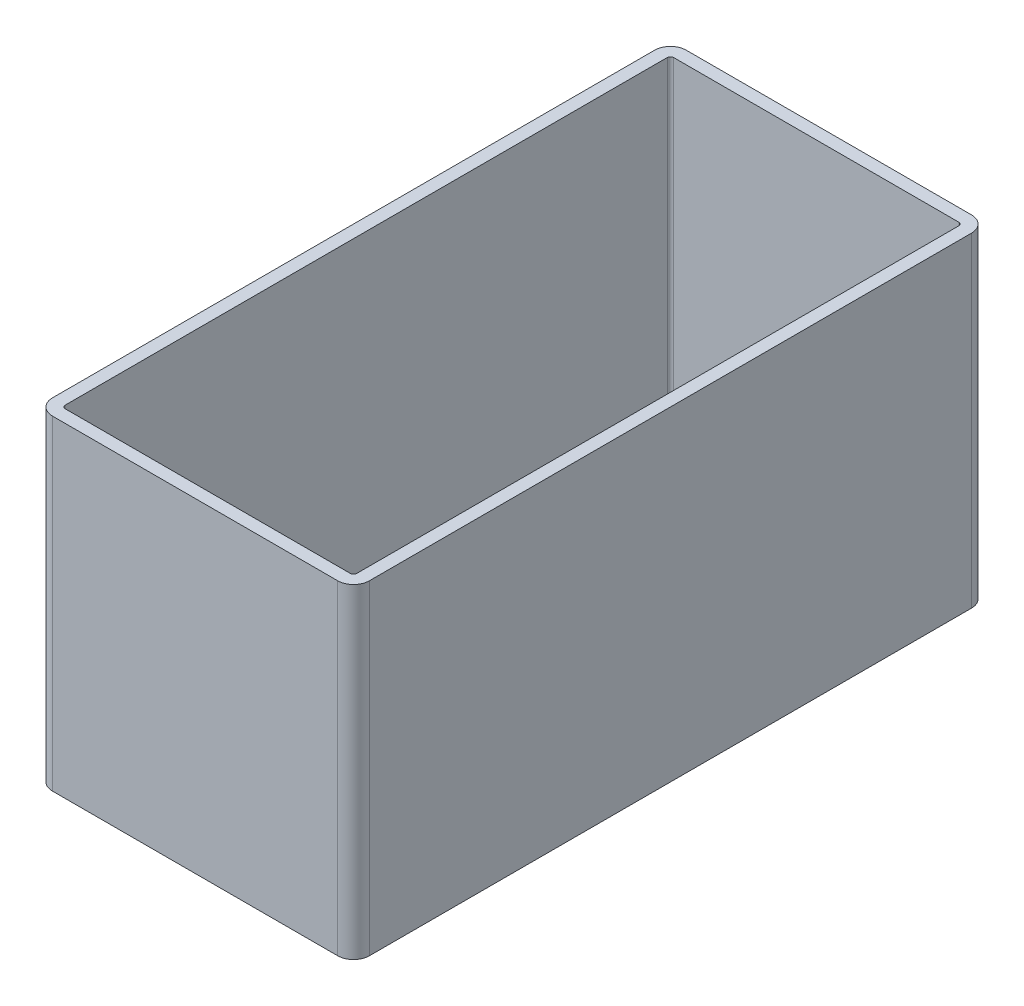
ISO-10303-21;
HEADER;
FILE_DESCRIPTION(('STEP AP214'),'2;1');
FILE_NAME('part.step','',(''),(''),'','','');
FILE_SCHEMA(('AUTOMOTIVE_DESIGN { 1 0 10303 214 1 1 1 1 }'));
ENDSEC;
DATA;
#1=APPLICATION_CONTEXT('core data for automotive mechanical design processes');
#2=APPLICATION_PROTOCOL_DEFINITION('international standard','automotive_design',2000,#1);
#3=PRODUCT_CONTEXT('',#1,'mechanical');
#4=PRODUCT('Part','Part','',(#3));
#5=PRODUCT_RELATED_PRODUCT_CATEGORY('part','',(#4));
#6=PRODUCT_DEFINITION_FORMATION('','',#4);
#7=PRODUCT_DEFINITION_CONTEXT('part definition',#1,'design');
#8=PRODUCT_DEFINITION('design','',#6,#7);
#9=PRODUCT_DEFINITION_SHAPE('','',#8);
#10=(LENGTH_UNIT() NAMED_UNIT(*) SI_UNIT(.MILLI.,.METRE.));
#11=(NAMED_UNIT(*) PLANE_ANGLE_UNIT() SI_UNIT($,.RADIAN.));
#12=(NAMED_UNIT(*) SI_UNIT($,.STERADIAN.) SOLID_ANGLE_UNIT());
#13=UNCERTAINTY_MEASURE_WITH_UNIT(LENGTH_MEASURE(1.E-05),#10,'distance_accuracy_value','');
#14=(GEOMETRIC_REPRESENTATION_CONTEXT(3) GLOBAL_UNCERTAINTY_ASSIGNED_CONTEXT((#13)) GLOBAL_UNIT_ASSIGNED_CONTEXT((#10,
#11,#12)) REPRESENTATION_CONTEXT('',''));
#15=CARTESIAN_POINT('',(0.,0.,0.));
#16=DIRECTION('',(0.,0.,1.));
#17=DIRECTION('',(1.,0.,0.));
#18=AXIS2_PLACEMENT_3D('',#15,#16,#17);
#19=CARTESIAN_POINT('',(9.99999999999999,10.25,-20.));
#20=DIRECTION('',(-1.,0.,0.));
#21=DIRECTION('',(0.,0.,1.));
#22=AXIS2_PLACEMENT_3D('',#19,#20,#21);
#23=PLANE('',#22);
#24=DIRECTION('',(0.,0.,-1.));
#25=VECTOR('',#24,1.);
#26=CARTESIAN_POINT('',(9.99999999999999,-10.25,-20.));
#27=LINE('',#26,#25);
#28=CARTESIAN_POINT('',(10.,-10.25,19.));
#29=VERTEX_POINT('',#28);
#30=CARTESIAN_POINT('',(9.99999999999999,-10.25,-19.));
#31=VERTEX_POINT('',#30);
#32=EDGE_CURVE('E203',#29,#31,#27,.T.);
#33=ORIENTED_EDGE('',*,*,#32,.T.);
#34=DIRECTION('',(0.,-1.,0.));
#35=VECTOR('',#34,1.);
#36=CARTESIAN_POINT('',(9.99999999999999,10.25,-19.));
#37=LINE('',#36,#35);
#38=CARTESIAN_POINT('',(9.99999999999999,10.25,-19.));
#39=VERTEX_POINT('',#38);
#40=EDGE_CURVE('E267',#31,#39,#37,.F.);
#41=ORIENTED_EDGE('',*,*,#40,.T.);
#42=DIRECTION('',(0.,0.,-1.));
#43=VECTOR('',#42,1.);
#44=CARTESIAN_POINT('',(9.99999999999999,10.25,-20.));
#45=LINE('',#44,#43);
#46=CARTESIAN_POINT('',(10.,10.25,19.));
#47=VERTEX_POINT('',#46);
#48=EDGE_CURVE('E215',#47,#39,#45,.T.);
#49=ORIENTED_EDGE('',*,*,#48,.F.);
#50=DIRECTION('',(0.,-1.,0.));
#51=VECTOR('',#50,1.);
#52=CARTESIAN_POINT('',(10.,10.25,19.));
#53=LINE('',#52,#51);
#54=EDGE_CURVE('E264',#47,#29,#53,.T.);
#55=ORIENTED_EDGE('',*,*,#54,.T.);
#56=EDGE_LOOP('',(#33,#41,#49,#55));
#57=FACE_BOUND('',#56,.T.);
#58=ADVANCED_FACE('F34',(#57),#23,.F.);
#59=CARTESIAN_POINT('',(-10.,10.25,-20.));
#60=DIRECTION('',(0.,0.,1.));
#61=DIRECTION('',(1.,0.,0.));
#62=AXIS2_PLACEMENT_3D('',#59,#60,#61);
#63=PLANE('',#62);
#64=DIRECTION('',(-1.,0.,0.));
#65=VECTOR('',#64,1.);
#66=CARTESIAN_POINT('',(-10.,-10.25,-20.));
#67=LINE('',#66,#65);
#68=CARTESIAN_POINT('',(8.99999999999999,-10.25,-20.));
#69=VERTEX_POINT('',#68);
#70=CARTESIAN_POINT('',(-9.00000000000001,-10.25,-20.));
#71=VERTEX_POINT('',#70);
#72=EDGE_CURVE('E231',#69,#71,#67,.T.);
#73=ORIENTED_EDGE('',*,*,#72,.T.);
#74=DIRECTION('',(0.,-1.,0.));
#75=VECTOR('',#74,1.);
#76=CARTESIAN_POINT('',(-9.00000000000001,10.25,-20.));
#77=LINE('',#76,#75);
#78=CARTESIAN_POINT('',(-9.00000000000001,10.25,-20.));
#79=VERTEX_POINT('',#78);
#80=EDGE_CURVE('E254',#71,#79,#77,.F.);
#81=ORIENTED_EDGE('',*,*,#80,.T.);
#82=DIRECTION('',(-1.,0.,0.));
#83=VECTOR('',#82,1.);
#84=CARTESIAN_POINT('',(-10.,10.25,-20.));
#85=LINE('',#84,#83);
#86=CARTESIAN_POINT('',(8.99999999999999,10.25,-20.));
#87=VERTEX_POINT('',#86);
#88=EDGE_CURVE('E218',#87,#79,#85,.T.);
#89=ORIENTED_EDGE('',*,*,#88,.F.);
#90=DIRECTION('',(0.,-1.,0.));
#91=VECTOR('',#90,1.);
#92=CARTESIAN_POINT('',(8.99999999999999,10.25,-20.));
#93=LINE('',#92,#91);
#94=EDGE_CURVE('E251',#87,#69,#93,.T.);
#95=ORIENTED_EDGE('',*,*,#94,.T.);
#96=EDGE_LOOP('',(#73,#81,#89,#95));
#97=FACE_BOUND('',#96,.T.);
#98=ADVANCED_FACE('F295',(#97),#63,.F.);
#99=CARTESIAN_POINT('',(-10.,10.25,-20.));
#100=DIRECTION('',(1.,0.,0.));
#101=DIRECTION('',(0.,0.,-1.));
#102=AXIS2_PLACEMENT_3D('',#99,#100,#101);
#103=PLANE('',#102);
#104=DIRECTION('',(0.,0.,1.));
#105=VECTOR('',#104,1.);
#106=CARTESIAN_POINT('',(-10.,10.25,-20.));
#107=LINE('',#106,#105);
#108=CARTESIAN_POINT('',(-10.,10.25,-19.));
#109=VERTEX_POINT('',#108);
#110=CARTESIAN_POINT('',(-10.,10.25,19.));
#111=VERTEX_POINT('',#110);
#112=EDGE_CURVE('E222',#109,#111,#107,.T.);
#113=ORIENTED_EDGE('',*,*,#112,.F.);
#114=DIRECTION('',(0.,-1.,0.));
#115=VECTOR('',#114,1.);
#116=CARTESIAN_POINT('',(-10.,10.25,-19.));
#117=LINE('',#116,#115);
#118=CARTESIAN_POINT('',(-10.,-10.25,-19.));
#119=VERTEX_POINT('',#118);
#120=EDGE_CURVE('E240',#109,#119,#117,.T.);
#121=ORIENTED_EDGE('',*,*,#120,.T.);
#122=DIRECTION('',(0.,0.,1.));
#123=VECTOR('',#122,1.);
#124=CARTESIAN_POINT('',(-10.,-10.25,-20.));
#125=LINE('',#124,#123);
#126=CARTESIAN_POINT('',(-10.,-10.25,19.));
#127=VERTEX_POINT('',#126);
#128=EDGE_CURVE('E234',#119,#127,#125,.T.);
#129=ORIENTED_EDGE('',*,*,#128,.T.);
#130=DIRECTION('',(0.,-1.,0.));
#131=VECTOR('',#130,1.);
#132=CARTESIAN_POINT('',(-10.,10.25,19.));
#133=LINE('',#132,#131);
#134=EDGE_CURVE('E228',#127,#111,#133,.F.);
#135=ORIENTED_EDGE('',*,*,#134,.T.);
#136=EDGE_LOOP('',(#113,#121,#129,#135));
#137=FACE_BOUND('',#136,.T.);
#138=ADVANCED_FACE('F303',(#137),#103,.F.);
#139=CARTESIAN_POINT('',(-10.,10.25,20.));
#140=DIRECTION('',(0.,0.,-1.));
#141=DIRECTION('',(-1.,0.,0.));
#142=AXIS2_PLACEMENT_3D('',#139,#140,#141);
#143=PLANE('',#142);
#144=DIRECTION('',(1.,0.,0.));
#145=VECTOR('',#144,1.);
#146=CARTESIAN_POINT('',(-10.,-10.25,20.));
#147=LINE('',#146,#145);
#148=CARTESIAN_POINT('',(-9.,-10.25,20.));
#149=VERTEX_POINT('',#148);
#150=CARTESIAN_POINT('',(9.,-10.25,20.));
#151=VERTEX_POINT('',#150);
#152=EDGE_CURVE('E219',#149,#151,#147,.T.);
#153=ORIENTED_EDGE('',*,*,#152,.T.);
#154=DIRECTION('',(0.,-1.,0.));
#155=VECTOR('',#154,1.);
#156=CARTESIAN_POINT('',(9.,10.25,20.));
#157=LINE('',#156,#155);
#158=CARTESIAN_POINT('',(9.,10.25,20.));
#159=VERTEX_POINT('',#158);
#160=EDGE_CURVE('E11',#151,#159,#157,.F.);
#161=ORIENTED_EDGE('',*,*,#160,.T.);
#162=DIRECTION('',(1.,0.,0.));
#163=VECTOR('',#162,1.);
#164=CARTESIAN_POINT('',(-10.,10.25,20.));
#165=LINE('',#164,#163);
#166=CARTESIAN_POINT('',(-9.,10.25,20.));
#167=VERTEX_POINT('',#166);
#168=EDGE_CURVE('E225',#167,#159,#165,.T.);
#169=ORIENTED_EDGE('',*,*,#168,.F.);
#170=DIRECTION('',(0.,-1.,0.));
#171=VECTOR('',#170,1.);
#172=CARTESIAN_POINT('',(-9.,10.25,20.));
#173=LINE('',#172,#171);
#174=EDGE_CURVE('E42',#167,#149,#173,.T.);
#175=ORIENTED_EDGE('',*,*,#174,.T.);
#176=EDGE_LOOP('',(#153,#161,#169,#175));
#177=FACE_BOUND('',#176,.T.);
#178=ADVANCED_FACE('F273',(#177),#143,.F.);
#179=CARTESIAN_POINT('',(0.,10.25,0.));
#180=DIRECTION('',(0.,1.,0.));
#181=DIRECTION('',(0.,0.,1.));
#182=AXIS2_PLACEMENT_3D('',#179,#180,#181);
#183=PLANE('',#182);
#184=CARTESIAN_POINT('',(8.99999999999999,10.25,-19.));
#185=DIRECTION('',(0.,1.,0.));
#186=DIRECTION('',(0.,0.,1.));
#187=AXIS2_PLACEMENT_3D('',#184,#185,#186);
#188=CIRCLE('',#187,0.200000000000004);
#189=CARTESIAN_POINT('',(9.2,10.25,-19.));
#190=VERTEX_POINT('',#189);
#191=CARTESIAN_POINT('',(8.99999999999999,10.25,-19.2));
#192=VERTEX_POINT('',#191);
#193=EDGE_CURVE('E49',#190,#192,#188,.T.);
#194=ORIENTED_EDGE('',*,*,#193,.F.);
#195=DIRECTION('',(0.,0.,-1.));
#196=VECTOR('',#195,1.);
#197=CARTESIAN_POINT('',(9.2,10.25,19.));
#198=LINE('',#197,#196);
#199=CARTESIAN_POINT('',(9.2,10.25,19.));
#200=VERTEX_POINT('',#199);
#201=EDGE_CURVE('E165',#200,#190,#198,.T.);
#202=ORIENTED_EDGE('',*,*,#201,.F.);
#203=CARTESIAN_POINT('',(9.,10.25,19.));
#204=DIRECTION('',(0.,1.,0.));
#205=DIRECTION('',(0.,0.,1.));
#206=AXIS2_PLACEMENT_3D('',#203,#204,#205);
#207=CIRCLE('',#206,0.200000000000001);
#208=CARTESIAN_POINT('',(9.,10.25,19.2));
#209=VERTEX_POINT('',#208);
#210=EDGE_CURVE('E168',#209,#200,#207,.T.);
#211=ORIENTED_EDGE('',*,*,#210,.F.);
#212=DIRECTION('',(1.,0.,0.));
#213=VECTOR('',#212,1.);
#214=CARTESIAN_POINT('',(-9.,10.25,19.2));
#215=LINE('',#214,#213);
#216=CARTESIAN_POINT('',(-9.,10.25,19.2));
#217=VERTEX_POINT('',#216);
#218=EDGE_CURVE('E196',#217,#209,#215,.T.);
#219=ORIENTED_EDGE('',*,*,#218,.F.);
#220=CARTESIAN_POINT('',(-9.,10.25,19.));
#221=DIRECTION('',(0.,1.,0.));
#222=DIRECTION('',(0.,0.,1.));
#223=AXIS2_PLACEMENT_3D('',#220,#221,#222);
#224=CIRCLE('',#223,0.200000000000001);
#225=CARTESIAN_POINT('',(-9.2,10.25,19.));
#226=VERTEX_POINT('',#225);
#227=EDGE_CURVE('E193',#226,#217,#224,.T.);
#228=ORIENTED_EDGE('',*,*,#227,.F.);
#229=DIRECTION('',(0.,0.,1.));
#230=VECTOR('',#229,1.);
#231=CARTESIAN_POINT('',(-9.2,10.25,-19.));
#232=LINE('',#231,#230);
#233=CARTESIAN_POINT('',(-9.2,10.25,-19.));
#234=VERTEX_POINT('',#233);
#235=EDGE_CURVE('E190',#234,#226,#232,.T.);
#236=ORIENTED_EDGE('',*,*,#235,.F.);
#237=CARTESIAN_POINT('',(-9.00000000000001,10.25,-19.));
#238=DIRECTION('',(0.,1.,0.));
#239=DIRECTION('',(0.,0.,1.));
#240=AXIS2_PLACEMENT_3D('',#237,#238,#239);
#241=CIRCLE('',#240,0.2);
#242=CARTESIAN_POINT('',(-9.00000000000001,10.25,-19.2));
#243=VERTEX_POINT('',#242);
#244=EDGE_CURVE('E187',#243,#234,#241,.T.);
#245=ORIENTED_EDGE('',*,*,#244,.F.);
#246=DIRECTION('',(-1.,0.,0.));
#247=VECTOR('',#246,1.);
#248=CARTESIAN_POINT('',(8.99999999999999,10.25,-19.2));
#249=LINE('',#248,#247);
#250=EDGE_CURVE('E185',#192,#243,#249,.T.);
#251=ORIENTED_EDGE('',*,*,#250,.F.);
#252=EDGE_LOOP('',(#194,#202,#211,#219,#228,#236,#245,#251));
#253=FACE_BOUND('',#252,.T.);
#254=ORIENTED_EDGE('',*,*,#88,.T.);
#255=CARTESIAN_POINT('',(-9.00000000000001,10.25,-19.));
#256=DIRECTION('',(0.,1.,0.));
#257=DIRECTION('',(0.,0.,1.));
#258=AXIS2_PLACEMENT_3D('',#255,#256,#257);
#259=CIRCLE('',#258,1.);
#260=EDGE_CURVE('E262',#79,#109,#259,.T.);
#261=ORIENTED_EDGE('',*,*,#260,.T.);
#262=ORIENTED_EDGE('',*,*,#112,.T.);
#263=CARTESIAN_POINT('',(-9.,10.25,19.));
#264=DIRECTION('',(0.,1.,0.));
#265=DIRECTION('',(0.,0.,1.));
#266=AXIS2_PLACEMENT_3D('',#263,#264,#265);
#267=CIRCLE('',#266,1.);
#268=EDGE_CURVE('E256',#111,#167,#267,.T.);
#269=ORIENTED_EDGE('',*,*,#268,.T.);
#270=ORIENTED_EDGE('',*,*,#168,.T.);
#271=CARTESIAN_POINT('',(9.,10.25,19.));
#272=DIRECTION('',(0.,1.,0.));
#273=DIRECTION('',(0.,0.,1.));
#274=AXIS2_PLACEMENT_3D('',#271,#272,#273);
#275=CIRCLE('',#274,1.);
#276=EDGE_CURVE('E258',#159,#47,#275,.T.);
#277=ORIENTED_EDGE('',*,*,#276,.T.);
#278=ORIENTED_EDGE('',*,*,#48,.T.);
#279=CARTESIAN_POINT('',(8.99999999999999,10.25,-19.));
#280=DIRECTION('',(0.,1.,0.));
#281=DIRECTION('',(0.,0.,1.));
#282=AXIS2_PLACEMENT_3D('',#279,#280,#281);
#283=CIRCLE('',#282,1.);
#284=EDGE_CURVE('E260',#39,#87,#283,.T.);
#285=ORIENTED_EDGE('',*,*,#284,.T.);
#286=EDGE_LOOP('',(#254,#261,#262,#269,#270,#277,#278,#285));
#287=FACE_BOUND('',#286,.T.);
#288=ADVANCED_FACE('F288',(#253,#287),#183,.T.);
#289=CARTESIAN_POINT('',(0.,-10.25,0.));
#290=DIRECTION('',(0.,1.,0.));
#291=DIRECTION('',(0.,0.,1.));
#292=AXIS2_PLACEMENT_3D('',#289,#290,#291);
#293=PLANE('',#292);
#294=DIRECTION('',(0.,0.,-1.));
#295=VECTOR('',#294,1.);
#296=CARTESIAN_POINT('',(9.2,-10.25,19.));
#297=LINE('',#296,#295);
#298=CARTESIAN_POINT('',(9.2,-10.25,19.));
#299=VERTEX_POINT('',#298);
#300=CARTESIAN_POINT('',(9.2,-10.25,-19.));
#301=VERTEX_POINT('',#300);
#302=EDGE_CURVE('E154',#299,#301,#297,.T.);
#303=ORIENTED_EDGE('',*,*,#302,.T.);
#304=CARTESIAN_POINT('',(8.99999999999999,-10.25,-19.));
#305=DIRECTION('',(0.,1.,0.));
#306=DIRECTION('',(0.,0.,1.));
#307=AXIS2_PLACEMENT_3D('',#304,#305,#306);
#308=CIRCLE('',#307,0.200000000000004);
#309=CARTESIAN_POINT('',(8.99999999999999,-10.25,-19.2));
#310=VERTEX_POINT('',#309);
#311=EDGE_CURVE('E148',#301,#310,#308,.T.);
#312=ORIENTED_EDGE('',*,*,#311,.T.);
#313=DIRECTION('',(-1.,0.,0.));
#314=VECTOR('',#313,1.);
#315=CARTESIAN_POINT('',(8.99999999999999,-10.25,-19.2));
#316=LINE('',#315,#314);
#317=CARTESIAN_POINT('',(-9.00000000000001,-10.25,-19.2));
#318=VERTEX_POINT('',#317);
#319=EDGE_CURVE('E157',#310,#318,#316,.T.);
#320=ORIENTED_EDGE('',*,*,#319,.T.);
#321=CARTESIAN_POINT('',(-9.00000000000001,-10.25,-19.));
#322=DIRECTION('',(0.,1.,0.));
#323=DIRECTION('',(0.,0.,1.));
#324=AXIS2_PLACEMENT_3D('',#321,#322,#323);
#325=CIRCLE('',#324,0.2);
#326=CARTESIAN_POINT('',(-9.2,-10.25,-19.));
#327=VERTEX_POINT('',#326);
#328=EDGE_CURVE('E57',#318,#327,#325,.T.);
#329=ORIENTED_EDGE('',*,*,#328,.T.);
#330=DIRECTION('',(0.,0.,1.));
#331=VECTOR('',#330,1.);
#332=CARTESIAN_POINT('',(-9.2,-10.25,-19.));
#333=LINE('',#332,#331);
#334=CARTESIAN_POINT('',(-9.2,-10.25,19.));
#335=VERTEX_POINT('',#334);
#336=EDGE_CURVE('E172',#327,#335,#333,.T.);
#337=ORIENTED_EDGE('',*,*,#336,.T.);
#338=CARTESIAN_POINT('',(-9.,-10.25,19.));
#339=DIRECTION('',(0.,1.,0.));
#340=DIRECTION('',(0.,0.,1.));
#341=AXIS2_PLACEMENT_3D('',#338,#339,#340);
#342=CIRCLE('',#341,0.200000000000001);
#343=CARTESIAN_POINT('',(-9.,-10.25,19.2));
#344=VERTEX_POINT('',#343);
#345=EDGE_CURVE('E175',#335,#344,#342,.T.);
#346=ORIENTED_EDGE('',*,*,#345,.T.);
#347=DIRECTION('',(1.,0.,0.));
#348=VECTOR('',#347,1.);
#349=CARTESIAN_POINT('',(-9.,-10.25,19.2));
#350=LINE('',#349,#348);
#351=CARTESIAN_POINT('',(9.,-10.25,19.2));
#352=VERTEX_POINT('',#351);
#353=EDGE_CURVE('E178',#344,#352,#350,.T.);
#354=ORIENTED_EDGE('',*,*,#353,.T.);
#355=CARTESIAN_POINT('',(9.,-10.25,19.));
#356=DIRECTION('',(0.,1.,0.));
#357=DIRECTION('',(0.,0.,1.));
#358=AXIS2_PLACEMENT_3D('',#355,#356,#357);
#359=CIRCLE('',#358,0.200000000000001);
#360=EDGE_CURVE('E181',#352,#299,#359,.T.);
#361=ORIENTED_EDGE('',*,*,#360,.T.);
#362=EDGE_LOOP('',(#303,#312,#320,#329,#337,#346,#354,#361));
#363=FACE_BOUND('',#362,.T.);
#364=ORIENTED_EDGE('',*,*,#128,.F.);
#365=CARTESIAN_POINT('',(-9.00000000000001,-10.25,-19.));
#366=DIRECTION('',(0.,1.,0.));
#367=DIRECTION('',(0.,0.,1.));
#368=AXIS2_PLACEMENT_3D('',#365,#366,#367);
#369=CIRCLE('',#368,1.);
#370=EDGE_CURVE('E249',#119,#71,#369,.F.);
#371=ORIENTED_EDGE('',*,*,#370,.T.);
#372=ORIENTED_EDGE('',*,*,#72,.F.);
#373=CARTESIAN_POINT('',(8.99999999999999,-10.25,-19.));
#374=DIRECTION('',(0.,1.,0.));
#375=DIRECTION('',(0.,0.,1.));
#376=AXIS2_PLACEMENT_3D('',#373,#374,#375);
#377=CIRCLE('',#376,1.);
#378=EDGE_CURVE('E247',#69,#31,#377,.F.);
#379=ORIENTED_EDGE('',*,*,#378,.T.);
#380=ORIENTED_EDGE('',*,*,#32,.F.);
#381=CARTESIAN_POINT('',(9.,-10.25,19.));
#382=DIRECTION('',(0.,1.,0.));
#383=DIRECTION('',(0.,0.,1.));
#384=AXIS2_PLACEMENT_3D('',#381,#382,#383);
#385=CIRCLE('',#384,1.);
#386=EDGE_CURVE('E245',#29,#151,#385,.F.);
#387=ORIENTED_EDGE('',*,*,#386,.T.);
#388=ORIENTED_EDGE('',*,*,#152,.F.);
#389=CARTESIAN_POINT('',(-9.,-10.25,19.));
#390=DIRECTION('',(0.,1.,0.));
#391=DIRECTION('',(0.,0.,1.));
#392=AXIS2_PLACEMENT_3D('',#389,#390,#391);
#393=CIRCLE('',#392,1.);
#394=EDGE_CURVE('E243',#149,#127,#393,.F.);
#395=ORIENTED_EDGE('',*,*,#394,.T.);
#396=EDGE_LOOP('',(#364,#371,#372,#379,#380,#387,#388,#395));
#397=FACE_BOUND('',#396,.T.);
#398=ADVANCED_FACE('F161',(#363,#397),#293,.F.);
#399=CARTESIAN_POINT('',(-9.00000000000001,10.25,-19.));
#400=DIRECTION('',(0.,-1.,0.));
#401=DIRECTION('',(0.,0.,-1.));
#402=AXIS2_PLACEMENT_3D('',#399,#400,#401);
#403=CYLINDRICAL_SURFACE('',#402,1.);
#404=ORIENTED_EDGE('',*,*,#260,.F.);
#405=ORIENTED_EDGE('',*,*,#80,.F.);
#406=ORIENTED_EDGE('',*,*,#370,.F.);
#407=ORIENTED_EDGE('',*,*,#120,.F.);
#408=EDGE_LOOP('',(#404,#405,#406,#407));
#409=FACE_BOUND('',#408,.T.);
#410=ADVANCED_FACE('F300',(#409),#403,.T.);
#411=CARTESIAN_POINT('',(8.99999999999999,10.25,-19.));
#412=DIRECTION('',(0.,-1.,0.));
#413=DIRECTION('',(0.,0.,-1.));
#414=AXIS2_PLACEMENT_3D('',#411,#412,#413);
#415=CYLINDRICAL_SURFACE('',#414,1.);
#416=ORIENTED_EDGE('',*,*,#284,.F.);
#417=ORIENTED_EDGE('',*,*,#40,.F.);
#418=ORIENTED_EDGE('',*,*,#378,.F.);
#419=ORIENTED_EDGE('',*,*,#94,.F.);
#420=EDGE_LOOP('',(#416,#417,#418,#419));
#421=FACE_BOUND('',#420,.T.);
#422=ADVANCED_FACE('F292',(#421),#415,.T.);
#423=CARTESIAN_POINT('',(9.,10.25,19.));
#424=DIRECTION('',(0.,-1.,0.));
#425=DIRECTION('',(0.,0.,-1.));
#426=AXIS2_PLACEMENT_3D('',#423,#424,#425);
#427=CYLINDRICAL_SURFACE('',#426,1.);
#428=ORIENTED_EDGE('',*,*,#276,.F.);
#429=ORIENTED_EDGE('',*,*,#160,.F.);
#430=ORIENTED_EDGE('',*,*,#386,.F.);
#431=ORIENTED_EDGE('',*,*,#54,.F.);
#432=EDGE_LOOP('',(#428,#429,#430,#431));
#433=FACE_BOUND('',#432,.T.);
#434=ADVANCED_FACE('F282',(#433),#427,.T.);
#435=CARTESIAN_POINT('',(-9.,10.25,19.));
#436=DIRECTION('',(0.,-1.,0.));
#437=DIRECTION('',(0.,0.,-1.));
#438=AXIS2_PLACEMENT_3D('',#435,#436,#437);
#439=CYLINDRICAL_SURFACE('',#438,1.);
#440=ORIENTED_EDGE('',*,*,#268,.F.);
#441=ORIENTED_EDGE('',*,*,#134,.F.);
#442=ORIENTED_EDGE('',*,*,#394,.F.);
#443=ORIENTED_EDGE('',*,*,#174,.F.);
#444=EDGE_LOOP('',(#440,#441,#442,#443));
#445=FACE_BOUND('',#444,.T.);
#446=ADVANCED_FACE('F36',(#445),#439,.T.);
#447=CARTESIAN_POINT('',(8.99999999999999,-10.25,-19.));
#448=DIRECTION('',(0.,1.,0.));
#449=DIRECTION('',(0.,0.,1.));
#450=AXIS2_PLACEMENT_3D('',#447,#448,#449);
#451=CYLINDRICAL_SURFACE('',#450,0.200000000000004);
#452=ORIENTED_EDGE('',*,*,#193,.T.);
#453=DIRECTION('',(0.,1.,0.));
#454=VECTOR('',#453,1.);
#455=CARTESIAN_POINT('',(8.99999999999999,-10.25,-19.2));
#456=LINE('',#455,#454);
#457=EDGE_CURVE('E144',#310,#192,#456,.T.);
#458=ORIENTED_EDGE('',*,*,#457,.F.);
#459=ORIENTED_EDGE('',*,*,#311,.F.);
#460=DIRECTION('',(0.,1.,0.));
#461=VECTOR('',#460,1.);
#462=CARTESIAN_POINT('',(9.2,-10.25,-19.));
#463=LINE('',#462,#461);
#464=EDGE_CURVE('E201',#301,#190,#463,.T.);
#465=ORIENTED_EDGE('',*,*,#464,.T.);
#466=EDGE_LOOP('',(#452,#458,#459,#465));
#467=FACE_BOUND('',#466,.T.);
#468=ADVANCED_FACE('F146',(#467),#451,.F.);
#469=CARTESIAN_POINT('',(9.2,-10.25,19.));
#470=DIRECTION('',(1.,0.,0.));
#471=DIRECTION('',(0.,0.,-1.));
#472=AXIS2_PLACEMENT_3D('',#469,#470,#471);
#473=PLANE('',#472);
#474=ORIENTED_EDGE('',*,*,#201,.T.);
#475=ORIENTED_EDGE('',*,*,#464,.F.);
#476=ORIENTED_EDGE('',*,*,#302,.F.);
#477=DIRECTION('',(0.,1.,0.));
#478=VECTOR('',#477,1.);
#479=CARTESIAN_POINT('',(9.2,-10.25,19.));
#480=LINE('',#479,#478);
#481=EDGE_CURVE('E204',#299,#200,#480,.T.);
#482=ORIENTED_EDGE('',*,*,#481,.T.);
#483=EDGE_LOOP('',(#474,#475,#476,#482));
#484=FACE_BOUND('',#483,.T.);
#485=ADVANCED_FACE('F310',(#484),#473,.F.);
#486=CARTESIAN_POINT('',(9.,-10.25,19.));
#487=DIRECTION('',(0.,1.,0.));
#488=DIRECTION('',(0.,0.,1.));
#489=AXIS2_PLACEMENT_3D('',#486,#487,#488);
#490=CYLINDRICAL_SURFACE('',#489,0.200000000000001);
#491=ORIENTED_EDGE('',*,*,#210,.T.);
#492=ORIENTED_EDGE('',*,*,#481,.F.);
#493=ORIENTED_EDGE('',*,*,#360,.F.);
#494=DIRECTION('',(0.,1.,0.));
#495=VECTOR('',#494,1.);
#496=CARTESIAN_POINT('',(9.,-10.25,19.2));
#497=LINE('',#496,#495);
#498=EDGE_CURVE('E206',#352,#209,#497,.T.);
#499=ORIENTED_EDGE('',*,*,#498,.T.);
#500=EDGE_LOOP('',(#491,#492,#493,#499));
#501=FACE_BOUND('',#500,.T.);
#502=ADVANCED_FACE('F370',(#501),#490,.F.);
#503=CARTESIAN_POINT('',(-9.,-10.25,19.2));
#504=DIRECTION('',(0.,0.,1.));
#505=DIRECTION('',(1.,0.,0.));
#506=AXIS2_PLACEMENT_3D('',#503,#504,#505);
#507=PLANE('',#506);
#508=ORIENTED_EDGE('',*,*,#218,.T.);
#509=ORIENTED_EDGE('',*,*,#498,.F.);
#510=ORIENTED_EDGE('',*,*,#353,.F.);
#511=DIRECTION('',(0.,1.,0.));
#512=VECTOR('',#511,1.);
#513=CARTESIAN_POINT('',(-9.,-10.25,19.2));
#514=LINE('',#513,#512);
#515=EDGE_CURVE('E208',#344,#217,#514,.T.);
#516=ORIENTED_EDGE('',*,*,#515,.T.);
#517=EDGE_LOOP('',(#508,#509,#510,#516));
#518=FACE_BOUND('',#517,.T.);
#519=ADVANCED_FACE('F380',(#518),#507,.F.);
#520=CARTESIAN_POINT('',(-9.,-10.25,19.));
#521=DIRECTION('',(0.,1.,0.));
#522=DIRECTION('',(0.,0.,1.));
#523=AXIS2_PLACEMENT_3D('',#520,#521,#522);
#524=CYLINDRICAL_SURFACE('',#523,0.200000000000001);
#525=ORIENTED_EDGE('',*,*,#227,.T.);
#526=ORIENTED_EDGE('',*,*,#515,.F.);
#527=ORIENTED_EDGE('',*,*,#345,.F.);
#528=DIRECTION('',(0.,1.,0.));
#529=VECTOR('',#528,1.);
#530=CARTESIAN_POINT('',(-9.2,-10.25,19.));
#531=LINE('',#530,#529);
#532=EDGE_CURVE('E210',#335,#226,#531,.T.);
#533=ORIENTED_EDGE('',*,*,#532,.T.);
#534=EDGE_LOOP('',(#525,#526,#527,#533));
#535=FACE_BOUND('',#534,.T.);
#536=ADVANCED_FACE('F390',(#535),#524,.F.);
#537=CARTESIAN_POINT('',(-9.2,-10.25,-19.));
#538=DIRECTION('',(-1.,0.,0.));
#539=DIRECTION('',(0.,0.,1.));
#540=AXIS2_PLACEMENT_3D('',#537,#538,#539);
#541=PLANE('',#540);
#542=ORIENTED_EDGE('',*,*,#235,.T.);
#543=ORIENTED_EDGE('',*,*,#532,.F.);
#544=ORIENTED_EDGE('',*,*,#336,.F.);
#545=DIRECTION('',(0.,1.,0.));
#546=VECTOR('',#545,1.);
#547=CARTESIAN_POINT('',(-9.2,-10.25,-19.));
#548=LINE('',#547,#546);
#549=EDGE_CURVE('E212',#327,#234,#548,.T.);
#550=ORIENTED_EDGE('',*,*,#549,.T.);
#551=EDGE_LOOP('',(#542,#543,#544,#550));
#552=FACE_BOUND('',#551,.T.);
#553=ADVANCED_FACE('F400',(#552),#541,.F.);
#554=CARTESIAN_POINT('',(-9.00000000000001,-10.25,-19.));
#555=DIRECTION('',(0.,1.,0.));
#556=DIRECTION('',(0.,0.,1.));
#557=AXIS2_PLACEMENT_3D('',#554,#555,#556);
#558=CYLINDRICAL_SURFACE('',#557,0.2);
#559=ORIENTED_EDGE('',*,*,#244,.T.);
#560=ORIENTED_EDGE('',*,*,#549,.F.);
#561=ORIENTED_EDGE('',*,*,#328,.F.);
#562=DIRECTION('',(0.,1.,0.));
#563=VECTOR('',#562,1.);
#564=CARTESIAN_POINT('',(-9.00000000000001,-10.25,-19.2));
#565=LINE('',#564,#563);
#566=EDGE_CURVE('E153',#318,#243,#565,.T.);
#567=ORIENTED_EDGE('',*,*,#566,.T.);
#568=EDGE_LOOP('',(#559,#560,#561,#567));
#569=FACE_BOUND('',#568,.T.);
#570=ADVANCED_FACE('F410',(#569),#558,.F.);
#571=CARTESIAN_POINT('',(8.99999999999999,-10.25,-19.2));
#572=DIRECTION('',(0.,0.,-1.));
#573=DIRECTION('',(-1.,0.,0.));
#574=AXIS2_PLACEMENT_3D('',#571,#572,#573);
#575=PLANE('',#574);
#576=ORIENTED_EDGE('',*,*,#250,.T.);
#577=ORIENTED_EDGE('',*,*,#566,.F.);
#578=ORIENTED_EDGE('',*,*,#319,.F.);
#579=ORIENTED_EDGE('',*,*,#457,.T.);
#580=EDGE_LOOP('',(#576,#577,#578,#579));
#581=FACE_BOUND('',#580,.T.);
#582=ADVANCED_FACE('F158',(#581),#575,.F.);
#583=CLOSED_SHELL('',(#58,#98,#138,#178,#288,#398,#410,#422,#434,#446,#468,#485,#502,#519,#536,
#553,#570,#582));
#584=MANIFOLD_SOLID_BREP('B2',#583);
#585=ADVANCED_BREP_SHAPE_REPRESENTATION('',(#18,#584),#14);
#586=SHAPE_DEFINITION_REPRESENTATION(#9,#585);
ENDSEC;
END-ISO-10303-21;
